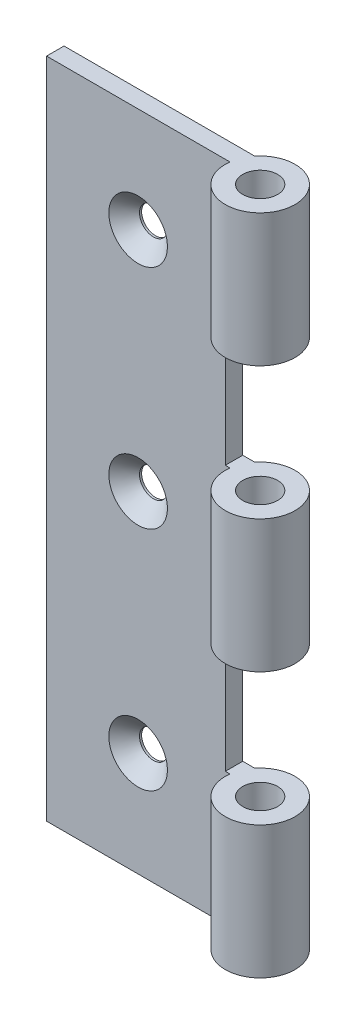
ISO-10303-21;
HEADER;
FILE_DESCRIPTION(('STEP AP214'),'2;1');
FILE_NAME('part.step','',(''),(''),'','','');
FILE_SCHEMA(('AUTOMOTIVE_DESIGN { 1 0 10303 214 1 1 1 1 }'));
ENDSEC;
DATA;
#1=APPLICATION_CONTEXT('core data for automotive mechanical design processes');
#2=APPLICATION_PROTOCOL_DEFINITION('international standard','automotive_design',2000,#1);
#3=PRODUCT_CONTEXT('',#1,'mechanical');
#4=PRODUCT('Part','Part','',(#3));
#5=PRODUCT_RELATED_PRODUCT_CATEGORY('part','',(#4));
#6=PRODUCT_DEFINITION_FORMATION('','',#4);
#7=PRODUCT_DEFINITION_CONTEXT('part definition',#1,'design');
#8=PRODUCT_DEFINITION('design','',#6,#7);
#9=PRODUCT_DEFINITION_SHAPE('','',#8);
#10=(LENGTH_UNIT() NAMED_UNIT(*) SI_UNIT(.MILLI.,.METRE.));
#11=(NAMED_UNIT(*) PLANE_ANGLE_UNIT() SI_UNIT($,.RADIAN.));
#12=(NAMED_UNIT(*) SI_UNIT($,.STERADIAN.) SOLID_ANGLE_UNIT());
#13=UNCERTAINTY_MEASURE_WITH_UNIT(LENGTH_MEASURE(1.E-05),#10,'distance_accuracy_value','');
#14=(GEOMETRIC_REPRESENTATION_CONTEXT(3) GLOBAL_UNCERTAINTY_ASSIGNED_CONTEXT((#13)) GLOBAL_UNIT_ASSIGNED_CONTEXT((#10,
#11,#12)) REPRESENTATION_CONTEXT('',''));
#15=CARTESIAN_POINT('',(0.,0.,0.));
#16=DIRECTION('',(0.,0.,1.));
#17=DIRECTION('',(1.,0.,0.));
#18=AXIS2_PLACEMENT_3D('',#15,#16,#17);
#19=CARTESIAN_POINT('',(-14.0612494995996,76.,-2.5));
#20=DIRECTION('',(0.,0.,1.));
#21=DIRECTION('',(1.,0.,0.));
#22=AXIS2_PLACEMENT_3D('',#19,#20,#21);
#23=PLANE('',#22);
#24=CARTESIAN_POINT('',(-14.5,12.,-2.5));
#25=DIRECTION('',(0.,0.,-1.));
#26=DIRECTION('',(1.,0.,0.));
#27=AXIS2_PLACEMENT_3D('',#24,#25,#26);
#28=CIRCLE('',#27,1.6);
#29=CARTESIAN_POINT('',(-12.9,12.,-2.5));
#30=VERTEX_POINT('',#29);
#31=EDGE_CURVE('E40',#30,#30,#28,.T.);
#32=ORIENTED_EDGE('',*,*,#31,.F.);
#33=EDGE_LOOP('',(#32));
#34=FACE_BOUND('',#33,.T.);
#35=CARTESIAN_POINT('',(-14.5,38.,-2.5));
#36=DIRECTION('',(0.,0.,-1.));
#37=DIRECTION('',(1.,0.,0.));
#38=AXIS2_PLACEMENT_3D('',#35,#36,#37);
#39=CIRCLE('',#38,1.6);
#40=CARTESIAN_POINT('',(-12.9,38.,-2.5));
#41=VERTEX_POINT('',#40);
#42=EDGE_CURVE('E224',#41,#41,#39,.T.);
#43=ORIENTED_EDGE('',*,*,#42,.F.);
#44=EDGE_LOOP('',(#43));
#45=FACE_BOUND('',#44,.T.);
#46=CARTESIAN_POINT('',(-14.5,64.,-2.5));
#47=DIRECTION('',(0.,0.,-1.));
#48=DIRECTION('',(1.,0.,0.));
#49=AXIS2_PLACEMENT_3D('',#46,#47,#48);
#50=CIRCLE('',#49,1.6);
#51=CARTESIAN_POINT('',(-12.9,64.,-2.5));
#52=VERTEX_POINT('',#51);
#53=EDGE_CURVE('E225',#52,#52,#50,.T.);
#54=ORIENTED_EDGE('',*,*,#53,.F.);
#55=EDGE_LOOP('',(#54));
#56=FACE_BOUND('',#55,.T.);
#57=DIRECTION('',(1.,0.,0.));
#58=VECTOR('',#57,1.);
#59=CARTESIAN_POINT('',(-14.0612494995996,30.4,-2.5));
#60=LINE('',#59,#58);
#61=CARTESIAN_POINT('',(-4.5,30.4,-2.5));
#62=VERTEX_POINT('',#61);
#63=CARTESIAN_POINT('',(-3.12249899919921,30.4,-2.5));
#64=VERTEX_POINT('',#63);
#65=EDGE_CURVE('E96',#62,#64,#60,.T.);
#66=ORIENTED_EDGE('',*,*,#65,.F.);
#67=DIRECTION('',(0.,-1.,0.));
#68=VECTOR('',#67,1.);
#69=CARTESIAN_POINT('',(-4.5,76.,-2.5));
#70=LINE('',#69,#68);
#71=CARTESIAN_POINT('',(-4.5,15.2,-2.5));
#72=VERTEX_POINT('',#71);
#73=EDGE_CURVE('E11',#62,#72,#70,.T.);
#74=ORIENTED_EDGE('',*,*,#73,.T.);
#75=DIRECTION('',(1.,0.,0.));
#76=VECTOR('',#75,1.);
#77=CARTESIAN_POINT('',(-14.0612494995996,15.2,-2.5));
#78=LINE('',#77,#76);
#79=CARTESIAN_POINT('',(-3.12249899919921,15.2,-2.5));
#80=VERTEX_POINT('',#79);
#81=EDGE_CURVE('E28',#72,#80,#78,.T.);
#82=ORIENTED_EDGE('',*,*,#81,.T.);
#83=DIRECTION('',(0.,-1.,0.));
#84=VECTOR('',#83,1.);
#85=CARTESIAN_POINT('',(-3.1224989991992,76.,-2.5));
#86=LINE('',#85,#84);
#87=CARTESIAN_POINT('',(-3.1224989991992,0.,-2.5));
#88=VERTEX_POINT('',#87);
#89=EDGE_CURVE('E247',#80,#88,#86,.T.);
#90=ORIENTED_EDGE('',*,*,#89,.T.);
#91=DIRECTION('',(-1.,0.,0.));
#92=VECTOR('',#91,1.);
#93=CARTESIAN_POINT('',(-14.0612494995996,0.,-2.5));
#94=LINE('',#93,#92);
#95=CARTESIAN_POINT('',(-25.,0.,-2.5));
#96=VERTEX_POINT('',#95);
#97=EDGE_CURVE('E251',#88,#96,#94,.T.);
#98=ORIENTED_EDGE('',*,*,#97,.T.);
#99=DIRECTION('',(0.,-1.,0.));
#100=VECTOR('',#99,1.);
#101=CARTESIAN_POINT('',(-25.,76.,-2.5));
#102=LINE('',#101,#100);
#103=CARTESIAN_POINT('',(-25.,76.,-2.5));
#104=VERTEX_POINT('',#103);
#105=EDGE_CURVE('E254',#104,#96,#102,.T.);
#106=ORIENTED_EDGE('',*,*,#105,.F.);
#107=DIRECTION('',(-1.,0.,0.));
#108=VECTOR('',#107,1.);
#109=CARTESIAN_POINT('',(-14.0612494995996,76.,-2.5));
#110=LINE('',#109,#108);
#111=CARTESIAN_POINT('',(-3.1224989991992,76.,-2.5));
#112=VERTEX_POINT('',#111);
#113=EDGE_CURVE('E231',#112,#104,#110,.T.);
#114=ORIENTED_EDGE('',*,*,#113,.F.);
#115=DIRECTION('',(0.,-1.,0.));
#116=VECTOR('',#115,1.);
#117=CARTESIAN_POINT('',(-3.1224989991992,76.,-2.5));
#118=LINE('',#117,#116);
#119=CARTESIAN_POINT('',(-3.12249899919921,60.8,-2.5));
#120=VERTEX_POINT('',#119);
#121=EDGE_CURVE('E187',#112,#120,#118,.T.);
#122=ORIENTED_EDGE('',*,*,#121,.T.);
#123=DIRECTION('',(1.,0.,0.));
#124=VECTOR('',#123,1.);
#125=CARTESIAN_POINT('',(-14.0612494995996,60.8,-2.5));
#126=LINE('',#125,#124);
#127=CARTESIAN_POINT('',(-4.5,60.8,-2.5));
#128=VERTEX_POINT('',#127);
#129=EDGE_CURVE('E244',#128,#120,#126,.T.);
#130=ORIENTED_EDGE('',*,*,#129,.F.);
#131=DIRECTION('',(0.,-1.,0.));
#132=VECTOR('',#131,1.);
#133=CARTESIAN_POINT('',(-4.5,76.,-2.5));
#134=LINE('',#133,#132);
#135=CARTESIAN_POINT('',(-4.5,45.6,-2.5));
#136=VERTEX_POINT('',#135);
#137=EDGE_CURVE('E277',#128,#136,#134,.T.);
#138=ORIENTED_EDGE('',*,*,#137,.T.);
#139=DIRECTION('',(1.,0.,0.));
#140=VECTOR('',#139,1.);
#141=CARTESIAN_POINT('',(-14.0612494995996,45.6,-2.5));
#142=LINE('',#141,#140);
#143=CARTESIAN_POINT('',(-3.12249899919921,45.6,-2.5));
#144=VERTEX_POINT('',#143);
#145=EDGE_CURVE('E290',#136,#144,#142,.T.);
#146=ORIENTED_EDGE('',*,*,#145,.T.);
#147=DIRECTION('',(0.,-1.,0.));
#148=VECTOR('',#147,1.);
#149=CARTESIAN_POINT('',(-3.1224989991992,76.,-2.5));
#150=LINE('',#149,#148);
#151=EDGE_CURVE('E287',#144,#64,#150,.T.);
#152=ORIENTED_EDGE('',*,*,#151,.T.);
#153=EDGE_LOOP('',(#66,#74,#82,#90,#98,#106,#114,#122,#130,#138,#146,#152));
#154=FACE_BOUND('',#153,.T.);
#155=ADVANCED_FACE('F17',(#34,#45,#56,#154),#23,.F.);
#156=CARTESIAN_POINT('',(0.,76.,0.));
#157=DIRECTION('',(0.,-1.,0.));
#158=DIRECTION('',(0.,0.,-1.));
#159=AXIS2_PLACEMENT_3D('',#156,#157,#158);
#160=CYLINDRICAL_SURFACE('',#159,4.);
#161=DIRECTION('',(0.,-1.,0.));
#162=VECTOR('',#161,1.);
#163=CARTESIAN_POINT('',(-3.96862696659689,76.,-0.5));
#164=LINE('',#163,#162);
#165=CARTESIAN_POINT('',(-3.96862696659689,45.6,-0.5));
#166=VERTEX_POINT('',#165);
#167=CARTESIAN_POINT('',(-3.96862696659689,30.4,-0.5));
#168=VERTEX_POINT('',#167);
#169=EDGE_CURVE('E291',#166,#168,#164,.T.);
#170=ORIENTED_EDGE('',*,*,#169,.T.);
#171=CARTESIAN_POINT('',(0.,30.4,0.));
#172=DIRECTION('',(0.,1.,0.));
#173=DIRECTION('',(0.,0.,-1.));
#174=AXIS2_PLACEMENT_3D('',#171,#172,#173);
#175=CIRCLE('',#174,4.);
#176=EDGE_CURVE('E203',#168,#64,#175,.T.);
#177=ORIENTED_EDGE('',*,*,#176,.T.);
#178=ORIENTED_EDGE('',*,*,#151,.F.);
#179=CARTESIAN_POINT('',(0.,45.6,0.));
#180=DIRECTION('',(0.,1.,0.));
#181=DIRECTION('',(0.,0.,-1.));
#182=AXIS2_PLACEMENT_3D('',#179,#180,#181);
#183=CIRCLE('',#182,4.);
#184=EDGE_CURVE('E240',#166,#144,#183,.T.);
#185=ORIENTED_EDGE('',*,*,#184,.F.);
#186=EDGE_LOOP('',(#170,#177,#178,#185));
#187=FACE_BOUND('',#186,.T.);
#188=ADVANCED_FACE('F425',(#187),#160,.T.);
#189=CARTESIAN_POINT('',(0.,76.,0.));
#190=DIRECTION('',(0.,-1.,0.));
#191=DIRECTION('',(0.,0.,-1.));
#192=AXIS2_PLACEMENT_3D('',#189,#190,#191);
#193=CYLINDRICAL_SURFACE('',#192,4.);
#194=DIRECTION('',(0.,-1.,0.));
#195=VECTOR('',#194,1.);
#196=CARTESIAN_POINT('',(-3.96862696659689,76.,-0.5));
#197=LINE('',#196,#195);
#198=CARTESIAN_POINT('',(-3.96862696659689,76.,-0.5));
#199=VERTEX_POINT('',#198);
#200=CARTESIAN_POINT('',(-3.96862696659689,60.8,-0.5));
#201=VERTEX_POINT('',#200);
#202=EDGE_CURVE('E184',#199,#201,#197,.T.);
#203=ORIENTED_EDGE('',*,*,#202,.T.);
#204=CARTESIAN_POINT('',(0.,60.8,0.));
#205=DIRECTION('',(0.,1.,0.));
#206=DIRECTION('',(0.,0.,-1.));
#207=AXIS2_PLACEMENT_3D('',#204,#205,#206);
#208=CIRCLE('',#207,4.);
#209=EDGE_CURVE('E191',#201,#120,#208,.T.);
#210=ORIENTED_EDGE('',*,*,#209,.T.);
#211=ORIENTED_EDGE('',*,*,#121,.F.);
#212=CARTESIAN_POINT('',(0.,76.,0.));
#213=DIRECTION('',(0.,-1.,0.));
#214=DIRECTION('',(0.,0.,-1.));
#215=AXIS2_PLACEMENT_3D('',#212,#213,#214);
#216=CIRCLE('',#215,4.);
#217=EDGE_CURVE('E180',#112,#199,#216,.T.);
#218=ORIENTED_EDGE('',*,*,#217,.T.);
#219=EDGE_LOOP('',(#203,#210,#211,#218));
#220=FACE_BOUND('',#219,.T.);
#221=ADVANCED_FACE('F182',(#220),#193,.T.);
#222=CARTESIAN_POINT('',(-14.4843134832984,76.,-0.5));
#223=DIRECTION('',(0.,0.,1.));
#224=DIRECTION('',(1.,0.,0.));
#225=AXIS2_PLACEMENT_3D('',#222,#223,#224);
#226=PLANE('',#225);
#227=CARTESIAN_POINT('',(-14.5,64.,-0.5));
#228=DIRECTION('',(0.,0.,-1.));
#229=DIRECTION('',(-1.,0.,0.));
#230=AXIS2_PLACEMENT_3D('',#227,#228,#229);
#231=CIRCLE('',#230,3.36);
#232=CARTESIAN_POINT('',(-17.86,64.,-0.5));
#233=VERTEX_POINT('',#232);
#234=EDGE_CURVE('E192',#233,#233,#231,.T.);
#235=ORIENTED_EDGE('',*,*,#234,.T.);
#236=EDGE_LOOP('',(#235));
#237=FACE_BOUND('',#236,.T.);
#238=CARTESIAN_POINT('',(-14.5,38.,-0.5));
#239=DIRECTION('',(0.,0.,-1.));
#240=DIRECTION('',(-1.,0.,0.));
#241=AXIS2_PLACEMENT_3D('',#238,#239,#240);
#242=CIRCLE('',#241,3.36);
#243=CARTESIAN_POINT('',(-17.86,38.,-0.5));
#244=VERTEX_POINT('',#243);
#245=EDGE_CURVE('E299',#244,#244,#242,.T.);
#246=ORIENTED_EDGE('',*,*,#245,.T.);
#247=EDGE_LOOP('',(#246));
#248=FACE_BOUND('',#247,.T.);
#249=CARTESIAN_POINT('',(-14.5,12.,-0.5));
#250=DIRECTION('',(0.,0.,-1.));
#251=DIRECTION('',(-1.,0.,0.));
#252=AXIS2_PLACEMENT_3D('',#249,#250,#251);
#253=CIRCLE('',#252,3.36);
#254=CARTESIAN_POINT('',(-17.86,12.,-0.5));
#255=VERTEX_POINT('',#254);
#256=EDGE_CURVE('E329',#255,#255,#253,.T.);
#257=ORIENTED_EDGE('',*,*,#256,.T.);
#258=EDGE_LOOP('',(#257));
#259=FACE_BOUND('',#258,.T.);
#260=DIRECTION('',(0.,-1.,0.));
#261=VECTOR('',#260,1.);
#262=CARTESIAN_POINT('',(-4.5,76.,-0.5));
#263=LINE('',#262,#261);
#264=CARTESIAN_POINT('',(-4.5,30.4,-0.5));
#265=VERTEX_POINT('',#264);
#266=CARTESIAN_POINT('',(-4.5,15.2,-0.5));
#267=VERTEX_POINT('',#266);
#268=EDGE_CURVE('E275',#265,#267,#263,.T.);
#269=ORIENTED_EDGE('',*,*,#268,.F.);
#270=DIRECTION('',(1.,0.,0.));
#271=VECTOR('',#270,1.);
#272=CARTESIAN_POINT('',(-14.4843134832984,30.4,-0.5));
#273=LINE('',#272,#271);
#274=EDGE_CURVE('E215',#265,#168,#273,.T.);
#275=ORIENTED_EDGE('',*,*,#274,.T.);
#276=ORIENTED_EDGE('',*,*,#169,.F.);
#277=DIRECTION('',(1.,0.,0.));
#278=VECTOR('',#277,1.);
#279=CARTESIAN_POINT('',(-14.4843134832984,45.6,-0.5));
#280=LINE('',#279,#278);
#281=CARTESIAN_POINT('',(-4.5,45.6,-0.5));
#282=VERTEX_POINT('',#281);
#283=EDGE_CURVE('E236',#282,#166,#280,.T.);
#284=ORIENTED_EDGE('',*,*,#283,.F.);
#285=DIRECTION('',(0.,-1.,0.));
#286=VECTOR('',#285,1.);
#287=CARTESIAN_POINT('',(-4.5,76.,-0.5));
#288=LINE('',#287,#286);
#289=CARTESIAN_POINT('',(-4.5,60.8,-0.5));
#290=VERTEX_POINT('',#289);
#291=EDGE_CURVE('E259',#290,#282,#288,.T.);
#292=ORIENTED_EDGE('',*,*,#291,.F.);
#293=DIRECTION('',(1.,0.,0.));
#294=VECTOR('',#293,1.);
#295=CARTESIAN_POINT('',(-14.4843134832984,60.8,-0.5));
#296=LINE('',#295,#294);
#297=EDGE_CURVE('E201',#290,#201,#296,.T.);
#298=ORIENTED_EDGE('',*,*,#297,.T.);
#299=ORIENTED_EDGE('',*,*,#202,.F.);
#300=DIRECTION('',(-1.,0.,0.));
#301=VECTOR('',#300,1.);
#302=CARTESIAN_POINT('',(-14.4843134832984,76.,-0.5));
#303=LINE('',#302,#301);
#304=CARTESIAN_POINT('',(-25.,76.,-0.5));
#305=VERTEX_POINT('',#304);
#306=EDGE_CURVE('E198',#199,#305,#303,.T.);
#307=ORIENTED_EDGE('',*,*,#306,.T.);
#308=DIRECTION('',(0.,-1.,0.));
#309=VECTOR('',#308,1.);
#310=CARTESIAN_POINT('',(-25.,76.,-0.5));
#311=LINE('',#310,#309);
#312=CARTESIAN_POINT('',(-25.,0.,-0.5));
#313=VERTEX_POINT('',#312);
#314=EDGE_CURVE('E210',#305,#313,#311,.T.);
#315=ORIENTED_EDGE('',*,*,#314,.T.);
#316=DIRECTION('',(-1.,0.,0.));
#317=VECTOR('',#316,1.);
#318=CARTESIAN_POINT('',(-14.4843134832984,0.,-0.5));
#319=LINE('',#318,#317);
#320=CARTESIAN_POINT('',(-3.96862696659689,0.,-0.5));
#321=VERTEX_POINT('',#320);
#322=EDGE_CURVE('E286',#321,#313,#319,.T.);
#323=ORIENTED_EDGE('',*,*,#322,.F.);
#324=DIRECTION('',(0.,-1.,0.));
#325=VECTOR('',#324,1.);
#326=CARTESIAN_POINT('',(-3.96862696659689,76.,-0.5));
#327=LINE('',#326,#325);
#328=CARTESIAN_POINT('',(-3.96862696659689,15.2,-0.5));
#329=VERTEX_POINT('',#328);
#330=EDGE_CURVE('E218',#329,#321,#327,.T.);
#331=ORIENTED_EDGE('',*,*,#330,.F.);
#332=DIRECTION('',(1.,0.,0.));
#333=VECTOR('',#332,1.);
#334=CARTESIAN_POINT('',(-14.4843134832984,15.2,-0.5));
#335=LINE('',#334,#333);
#336=EDGE_CURVE('E303',#267,#329,#335,.T.);
#337=ORIENTED_EDGE('',*,*,#336,.F.);
#338=EDGE_LOOP('',(#269,#275,#276,#284,#292,#298,#299,#307,#315,#323,#331,#337));
#339=FACE_BOUND('',#338,.T.);
#340=ADVANCED_FACE('F196',(#237,#248,#259,#339),#226,.T.);
#341=CARTESIAN_POINT('',(0.,76.,0.));
#342=DIRECTION('',(0.,-1.,0.));
#343=DIRECTION('',(0.,0.,-1.));
#344=AXIS2_PLACEMENT_3D('',#341,#342,#343);
#345=CYLINDRICAL_SURFACE('',#344,2.);
#346=CARTESIAN_POINT('',(0.,76.,0.));
#347=DIRECTION('',(0.,-1.,0.));
#348=DIRECTION('',(0.,0.,-1.));
#349=AXIS2_PLACEMENT_3D('',#346,#347,#348);
#350=CIRCLE('',#349,2.);
#351=CARTESIAN_POINT('',(0.,76.,-2.));
#352=VERTEX_POINT('',#351);
#353=EDGE_CURVE('E235',#352,#352,#350,.T.);
#354=ORIENTED_EDGE('',*,*,#353,.F.);
#355=EDGE_LOOP('',(#354));
#356=FACE_BOUND('',#355,.T.);
#357=CARTESIAN_POINT('',(0.,60.8,0.));
#358=DIRECTION('',(0.,1.,0.));
#359=DIRECTION('',(0.,0.,-1.));
#360=AXIS2_PLACEMENT_3D('',#357,#358,#359);
#361=CIRCLE('',#360,2.);
#362=CARTESIAN_POINT('',(0.,60.8,-2.));
#363=VERTEX_POINT('',#362);
#364=EDGE_CURVE('E262',#363,#363,#361,.T.);
#365=ORIENTED_EDGE('',*,*,#364,.F.);
#366=EDGE_LOOP('',(#365));
#367=FACE_BOUND('',#366,.T.);
#368=ADVANCED_FACE('F374',(#356,#367),#345,.F.);
#369=CARTESIAN_POINT('',(0.,76.,0.));
#370=DIRECTION('',(0.,-1.,0.));
#371=DIRECTION('',(0.,0.,-1.));
#372=AXIS2_PLACEMENT_3D('',#369,#370,#371);
#373=CYLINDRICAL_SURFACE('',#372,4.);
#374=CARTESIAN_POINT('',(0.,15.2,0.));
#375=DIRECTION('',(0.,1.,0.));
#376=DIRECTION('',(0.,0.,-1.));
#377=AXIS2_PLACEMENT_3D('',#374,#375,#376);
#378=CIRCLE('',#377,4.);
#379=EDGE_CURVE('E300',#329,#80,#378,.T.);
#380=ORIENTED_EDGE('',*,*,#379,.F.);
#381=ORIENTED_EDGE('',*,*,#330,.T.);
#382=CARTESIAN_POINT('',(0.,0.,0.));
#383=DIRECTION('',(0.,-1.,0.));
#384=DIRECTION('',(0.,0.,-1.));
#385=AXIS2_PLACEMENT_3D('',#382,#383,#384);
#386=CIRCLE('',#385,4.);
#387=EDGE_CURVE('E282',#88,#321,#386,.T.);
#388=ORIENTED_EDGE('',*,*,#387,.F.);
#389=ORIENTED_EDGE('',*,*,#89,.F.);
#390=EDGE_LOOP('',(#380,#381,#388,#389));
#391=FACE_BOUND('',#390,.T.);
#392=ADVANCED_FACE('F377',(#391),#373,.T.);
#393=CARTESIAN_POINT('',(-25.,76.,-1.5));
#394=DIRECTION('',(-1.,0.,0.));
#395=DIRECTION('',(0.,0.,1.));
#396=AXIS2_PLACEMENT_3D('',#393,#394,#395);
#397=PLANE('',#396);
#398=DIRECTION('',(0.,0.,-1.));
#399=VECTOR('',#398,1.);
#400=CARTESIAN_POINT('',(-25.,0.,-1.5));
#401=LINE('',#400,#399);
#402=EDGE_CURVE('E295',#313,#96,#401,.T.);
#403=ORIENTED_EDGE('',*,*,#402,.F.);
#404=ORIENTED_EDGE('',*,*,#314,.F.);
#405=DIRECTION('',(0.,0.,-1.));
#406=VECTOR('',#405,1.);
#407=CARTESIAN_POINT('',(-25.,76.,-1.5));
#408=LINE('',#407,#406);
#409=EDGE_CURVE('E208',#305,#104,#408,.T.);
#410=ORIENTED_EDGE('',*,*,#409,.T.);
#411=ORIENTED_EDGE('',*,*,#105,.T.);
#412=EDGE_LOOP('',(#403,#404,#410,#411));
#413=FACE_BOUND('',#412,.T.);
#414=ADVANCED_FACE('F395',(#413),#397,.T.);
#415=CARTESIAN_POINT('',(0.,76.,0.));
#416=DIRECTION('',(0.,-1.,0.));
#417=DIRECTION('',(0.,0.,-1.));
#418=AXIS2_PLACEMENT_3D('',#415,#416,#417);
#419=CYLINDRICAL_SURFACE('',#418,2.);
#420=CARTESIAN_POINT('',(0.,15.2,0.));
#421=DIRECTION('',(0.,1.,0.));
#422=DIRECTION('',(0.,0.,-1.));
#423=AXIS2_PLACEMENT_3D('',#420,#421,#422);
#424=CIRCLE('',#423,2.);
#425=CARTESIAN_POINT('',(0.,15.2,-2.));
#426=VERTEX_POINT('',#425);
#427=EDGE_CURVE('E310',#426,#426,#424,.T.);
#428=ORIENTED_EDGE('',*,*,#427,.T.);
#429=EDGE_LOOP('',(#428));
#430=FACE_BOUND('',#429,.T.);
#431=CARTESIAN_POINT('',(0.,0.,0.));
#432=DIRECTION('',(0.,-1.,0.));
#433=DIRECTION('',(0.,0.,-1.));
#434=AXIS2_PLACEMENT_3D('',#431,#432,#433);
#435=CIRCLE('',#434,2.);
#436=CARTESIAN_POINT('',(0.,0.,-2.));
#437=VERTEX_POINT('',#436);
#438=EDGE_CURVE('E234',#437,#437,#435,.T.);
#439=ORIENTED_EDGE('',*,*,#438,.T.);
#440=EDGE_LOOP('',(#439));
#441=FACE_BOUND('',#440,.T.);
#442=ADVANCED_FACE('F481',(#430,#441),#419,.F.);
#443=CARTESIAN_POINT('',(-10.5,76.,0.));
#444=DIRECTION('',(0.,-1.,0.));
#445=DIRECTION('',(0.,0.,-1.));
#446=AXIS2_PLACEMENT_3D('',#443,#444,#445);
#447=PLANE('',#446);
#448=ORIENTED_EDGE('',*,*,#113,.T.);
#449=ORIENTED_EDGE('',*,*,#409,.F.);
#450=ORIENTED_EDGE('',*,*,#306,.F.);
#451=ORIENTED_EDGE('',*,*,#217,.F.);
#452=EDGE_LOOP('',(#448,#449,#450,#451));
#453=FACE_BOUND('',#452,.T.);
#454=ORIENTED_EDGE('',*,*,#353,.T.);
#455=EDGE_LOOP('',(#454));
#456=FACE_BOUND('',#455,.T.);
#457=ADVANCED_FACE('F205',(#453,#456),#447,.F.);
#458=CARTESIAN_POINT('',(-10.5,0.,0.));
#459=DIRECTION('',(0.,-1.,0.));
#460=DIRECTION('',(0.,0.,-1.));
#461=AXIS2_PLACEMENT_3D('',#458,#459,#460);
#462=PLANE('',#461);
#463=ORIENTED_EDGE('',*,*,#97,.F.);
#464=ORIENTED_EDGE('',*,*,#387,.T.);
#465=ORIENTED_EDGE('',*,*,#322,.T.);
#466=ORIENTED_EDGE('',*,*,#402,.T.);
#467=EDGE_LOOP('',(#463,#464,#465,#466));
#468=FACE_BOUND('',#467,.T.);
#469=ORIENTED_EDGE('',*,*,#438,.F.);
#470=EDGE_LOOP('',(#469));
#471=FACE_BOUND('',#470,.T.);
#472=ADVANCED_FACE('F403',(#468,#471),#462,.T.);
#473=CARTESIAN_POINT('',(-14.5,12.,-0.5));
#474=DIRECTION('',(0.,0.,-1.));
#475=DIRECTION('',(-1.,0.,0.));
#476=AXIS2_PLACEMENT_3D('',#473,#474,#475);
#477=CYLINDRICAL_SURFACE('',#476,1.6);
#478=CARTESIAN_POINT('',(-14.5,12.,-2.26));
#479=DIRECTION('',(0.,0.,-1.));
#480=DIRECTION('',(-1.,0.,0.));
#481=AXIS2_PLACEMENT_3D('',#478,#479,#480);
#482=CIRCLE('',#481,1.6);
#483=CARTESIAN_POINT('',(-16.1,12.,-2.26));
#484=VERTEX_POINT('',#483);
#485=EDGE_CURVE('E221',#484,#484,#482,.T.);
#486=ORIENTED_EDGE('',*,*,#485,.F.);
#487=EDGE_LOOP('',(#486));
#488=FACE_BOUND('',#487,.T.);
#489=ORIENTED_EDGE('',*,*,#31,.T.);
#490=EDGE_LOOP('',(#489));
#491=FACE_BOUND('',#490,.T.);
#492=ADVANCED_FACE('F468',(#488,#491),#477,.F.);
#493=CARTESIAN_POINT('',(-14.5,12.,-0.5));
#494=DIRECTION('',(0.,0.,1.));
#495=DIRECTION('',(1.,0.,0.));
#496=AXIS2_PLACEMENT_3D('',#493,#494,#495);
#497=CONICAL_SURFACE('',#496,3.36,0.785398163397448);
#498=ORIENTED_EDGE('',*,*,#485,.T.);
#499=EDGE_LOOP('',(#498));
#500=FACE_BOUND('',#499,.T.);
#501=ORIENTED_EDGE('',*,*,#256,.F.);
#502=EDGE_LOOP('',(#501));
#503=FACE_BOUND('',#502,.T.);
#504=ADVANCED_FACE('F463',(#500,#503),#497,.F.);
#505=CARTESIAN_POINT('',(-14.5,38.,-0.5));
#506=DIRECTION('',(0.,0.,-1.));
#507=DIRECTION('',(-1.,0.,0.));
#508=AXIS2_PLACEMENT_3D('',#505,#506,#507);
#509=CYLINDRICAL_SURFACE('',#508,1.6);
#510=CARTESIAN_POINT('',(-14.5,38.,-2.26));
#511=DIRECTION('',(0.,0.,-1.));
#512=DIRECTION('',(-1.,0.,0.));
#513=AXIS2_PLACEMENT_3D('',#510,#511,#512);
#514=CIRCLE('',#513,1.6);
#515=CARTESIAN_POINT('',(-16.1,38.,-2.26));
#516=VERTEX_POINT('',#515);
#517=EDGE_CURVE('E228',#516,#516,#514,.T.);
#518=ORIENTED_EDGE('',*,*,#517,.F.);
#519=EDGE_LOOP('',(#518));
#520=FACE_BOUND('',#519,.T.);
#521=ORIENTED_EDGE('',*,*,#42,.T.);
#522=EDGE_LOOP('',(#521));
#523=FACE_BOUND('',#522,.T.);
#524=ADVANCED_FACE('F460',(#520,#523),#509,.F.);
#525=CARTESIAN_POINT('',(-14.5,38.,-0.5));
#526=DIRECTION('',(0.,0.,1.));
#527=DIRECTION('',(1.,0.,0.));
#528=AXIS2_PLACEMENT_3D('',#525,#526,#527);
#529=CONICAL_SURFACE('',#528,3.36,0.785398163397448);
#530=ORIENTED_EDGE('',*,*,#517,.T.);
#531=EDGE_LOOP('',(#530));
#532=FACE_BOUND('',#531,.T.);
#533=ORIENTED_EDGE('',*,*,#245,.F.);
#534=EDGE_LOOP('',(#533));
#535=FACE_BOUND('',#534,.T.);
#536=ADVANCED_FACE('F455',(#532,#535),#529,.F.);
#537=CARTESIAN_POINT('',(-14.5,64.,-0.5));
#538=DIRECTION('',(0.,0.,-1.));
#539=DIRECTION('',(-1.,0.,0.));
#540=AXIS2_PLACEMENT_3D('',#537,#538,#539);
#541=CYLINDRICAL_SURFACE('',#540,1.6);
#542=CARTESIAN_POINT('',(-14.5,64.,-2.26));
#543=DIRECTION('',(0.,0.,-1.));
#544=DIRECTION('',(-1.,0.,0.));
#545=AXIS2_PLACEMENT_3D('',#542,#543,#544);
#546=CIRCLE('',#545,1.6);
#547=CARTESIAN_POINT('',(-16.1,64.,-2.26));
#548=VERTEX_POINT('',#547);
#549=EDGE_CURVE('E229',#548,#548,#546,.T.);
#550=ORIENTED_EDGE('',*,*,#549,.F.);
#551=EDGE_LOOP('',(#550));
#552=FACE_BOUND('',#551,.T.);
#553=ORIENTED_EDGE('',*,*,#53,.T.);
#554=EDGE_LOOP('',(#553));
#555=FACE_BOUND('',#554,.T.);
#556=ADVANCED_FACE('F451',(#552,#555),#541,.F.);
#557=CARTESIAN_POINT('',(-14.5,64.,-0.5));
#558=DIRECTION('',(0.,0.,1.));
#559=DIRECTION('',(1.,0.,0.));
#560=AXIS2_PLACEMENT_3D('',#557,#558,#559);
#561=CONICAL_SURFACE('',#560,3.36,0.785398163397448);
#562=ORIENTED_EDGE('',*,*,#549,.T.);
#563=EDGE_LOOP('',(#562));
#564=FACE_BOUND('',#563,.T.);
#565=ORIENTED_EDGE('',*,*,#234,.F.);
#566=EDGE_LOOP('',(#565));
#567=FACE_BOUND('',#566,.T.);
#568=ADVANCED_FACE('F454',(#564,#567),#561,.F.);
#569=CARTESIAN_POINT('',(-4.5,53.2,-91.333600454647));
#570=DIRECTION('',(-1.,0.,0.));
#571=DIRECTION('',(0.,1.,0.));
#572=AXIS2_PLACEMENT_3D('',#569,#570,#571);
#573=PLANE('',#572);
#574=DIRECTION('',(0.,0.,1.));
#575=VECTOR('',#574,1.);
#576=CARTESIAN_POINT('',(-4.5,60.8,-91.333600454647));
#577=LINE('',#576,#575);
#578=EDGE_CURVE('E255',#128,#290,#577,.T.);
#579=ORIENTED_EDGE('',*,*,#578,.T.);
#580=ORIENTED_EDGE('',*,*,#291,.T.);
#581=DIRECTION('',(0.,0.,1.));
#582=VECTOR('',#581,1.);
#583=CARTESIAN_POINT('',(-4.5,45.6,-91.333600454647));
#584=LINE('',#583,#582);
#585=EDGE_CURVE('E21',#136,#282,#584,.T.);
#586=ORIENTED_EDGE('',*,*,#585,.F.);
#587=ORIENTED_EDGE('',*,*,#137,.F.);
#588=EDGE_LOOP('',(#579,#580,#586,#587));
#589=FACE_BOUND('',#588,.T.);
#590=ADVANCED_FACE('F474',(#589),#573,.F.);
#591=CARTESIAN_POINT('',(0.,45.6,-91.333600454647));
#592=DIRECTION('',(0.,-1.,0.));
#593=DIRECTION('',(0.,0.,-1.));
#594=AXIS2_PLACEMENT_3D('',#591,#592,#593);
#595=PLANE('',#594);
#596=CARTESIAN_POINT('',(0.,45.6,0.));
#597=DIRECTION('',(0.,1.,0.));
#598=DIRECTION('',(0.,0.,-1.));
#599=AXIS2_PLACEMENT_3D('',#596,#597,#598);
#600=CIRCLE('',#599,2.);
#601=CARTESIAN_POINT('',(0.,45.6,-2.));
#602=VERTEX_POINT('',#601);
#603=EDGE_CURVE('E241',#602,#602,#600,.T.);
#604=ORIENTED_EDGE('',*,*,#603,.F.);
#605=EDGE_LOOP('',(#604));
#606=FACE_BOUND('',#605,.T.);
#607=ORIENTED_EDGE('',*,*,#585,.T.);
#608=ORIENTED_EDGE('',*,*,#283,.T.);
#609=ORIENTED_EDGE('',*,*,#184,.T.);
#610=ORIENTED_EDGE('',*,*,#145,.F.);
#611=EDGE_LOOP('',(#607,#608,#609,#610));
#612=FACE_BOUND('',#611,.T.);
#613=ADVANCED_FACE('F387',(#606,#612),#595,.F.);
#614=CARTESIAN_POINT('',(0.,60.8,-91.333600454647));
#615=DIRECTION('',(0.,-1.,0.));
#616=DIRECTION('',(0.,0.,-1.));
#617=AXIS2_PLACEMENT_3D('',#614,#615,#616);
#618=PLANE('',#617);
#619=ORIENTED_EDGE('',*,*,#364,.T.);
#620=EDGE_LOOP('',(#619));
#621=FACE_BOUND('',#620,.T.);
#622=ORIENTED_EDGE('',*,*,#129,.T.);
#623=ORIENTED_EDGE('',*,*,#209,.F.);
#624=ORIENTED_EDGE('',*,*,#297,.F.);
#625=ORIENTED_EDGE('',*,*,#578,.F.);
#626=EDGE_LOOP('',(#622,#623,#624,#625));
#627=FACE_BOUND('',#626,.T.);
#628=ADVANCED_FACE('F383',(#621,#627),#618,.T.);
#629=CARTESIAN_POINT('',(0.,76.,0.));
#630=DIRECTION('',(0.,-1.,0.));
#631=DIRECTION('',(0.,0.,-1.));
#632=AXIS2_PLACEMENT_3D('',#629,#630,#631);
#633=CYLINDRICAL_SURFACE('',#632,2.);
#634=ORIENTED_EDGE('',*,*,#603,.T.);
#635=EDGE_LOOP('',(#634));
#636=FACE_BOUND('',#635,.T.);
#637=CARTESIAN_POINT('',(0.,30.4,0.));
#638=DIRECTION('',(0.,1.,0.));
#639=DIRECTION('',(0.,0.,-1.));
#640=AXIS2_PLACEMENT_3D('',#637,#638,#639);
#641=CIRCLE('',#640,2.);
#642=CARTESIAN_POINT('',(0.,30.4,-2.));
#643=VERTEX_POINT('',#642);
#644=EDGE_CURVE('E266',#643,#643,#641,.T.);
#645=ORIENTED_EDGE('',*,*,#644,.F.);
#646=EDGE_LOOP('',(#645));
#647=FACE_BOUND('',#646,.T.);
#648=ADVANCED_FACE('F386',(#636,#647),#633,.F.);
#649=CARTESIAN_POINT('',(-4.5,22.8,-91.333600454647));
#650=DIRECTION('',(-1.,0.,0.));
#651=DIRECTION('',(0.,1.,0.));
#652=AXIS2_PLACEMENT_3D('',#649,#650,#651);
#653=PLANE('',#652);
#654=DIRECTION('',(0.,0.,1.));
#655=VECTOR('',#654,1.);
#656=CARTESIAN_POINT('',(-4.5,30.4,-91.333600454647));
#657=LINE('',#656,#655);
#658=EDGE_CURVE('E245',#62,#265,#657,.T.);
#659=ORIENTED_EDGE('',*,*,#658,.T.);
#660=ORIENTED_EDGE('',*,*,#268,.T.);
#661=DIRECTION('',(0.,0.,1.));
#662=VECTOR('',#661,1.);
#663=CARTESIAN_POINT('',(-4.5,15.2,-91.333600454647));
#664=LINE('',#663,#662);
#665=EDGE_CURVE('E267',#72,#267,#664,.T.);
#666=ORIENTED_EDGE('',*,*,#665,.F.);
#667=ORIENTED_EDGE('',*,*,#73,.F.);
#668=EDGE_LOOP('',(#659,#660,#666,#667));
#669=FACE_BOUND('',#668,.T.);
#670=ADVANCED_FACE('F429',(#669),#653,.F.);
#671=CARTESIAN_POINT('',(0.,30.4,-91.333600454647));
#672=DIRECTION('',(0.,-1.,0.));
#673=DIRECTION('',(0.,0.,-1.));
#674=AXIS2_PLACEMENT_3D('',#671,#672,#673);
#675=PLANE('',#674);
#676=ORIENTED_EDGE('',*,*,#644,.T.);
#677=EDGE_LOOP('',(#676));
#678=FACE_BOUND('',#677,.T.);
#679=ORIENTED_EDGE('',*,*,#65,.T.);
#680=ORIENTED_EDGE('',*,*,#176,.F.);
#681=ORIENTED_EDGE('',*,*,#274,.F.);
#682=ORIENTED_EDGE('',*,*,#658,.F.);
#683=EDGE_LOOP('',(#679,#680,#681,#682));
#684=FACE_BOUND('',#683,.T.);
#685=ADVANCED_FACE('F422',(#678,#684),#675,.T.);
#686=CARTESIAN_POINT('',(0.,15.2,-91.333600454647));
#687=DIRECTION('',(0.,-1.,0.));
#688=DIRECTION('',(0.,0.,-1.));
#689=AXIS2_PLACEMENT_3D('',#686,#687,#688);
#690=PLANE('',#689);
#691=ORIENTED_EDGE('',*,*,#427,.F.);
#692=EDGE_LOOP('',(#691));
#693=FACE_BOUND('',#692,.T.);
#694=ORIENTED_EDGE('',*,*,#665,.T.);
#695=ORIENTED_EDGE('',*,*,#336,.T.);
#696=ORIENTED_EDGE('',*,*,#379,.T.);
#697=ORIENTED_EDGE('',*,*,#81,.F.);
#698=EDGE_LOOP('',(#694,#695,#696,#697));
#699=FACE_BOUND('',#698,.T.);
#700=ADVANCED_FACE('F19',(#693,#699),#690,.F.);
#701=CLOSED_SHELL('',(#155,#188,#221,#340,#368,#392,#414,#442,#457,#472,#492,#504,#524,#536,
#556,#568,#590,#613,#628,#648,#670,#685,#700));
#702=MANIFOLD_SOLID_BREP('B1',#701);
#703=ADVANCED_BREP_SHAPE_REPRESENTATION('',(#18,#702),#14);
#704=SHAPE_DEFINITION_REPRESENTATION(#9,#703);
ENDSEC;
END-ISO-10303-21;
